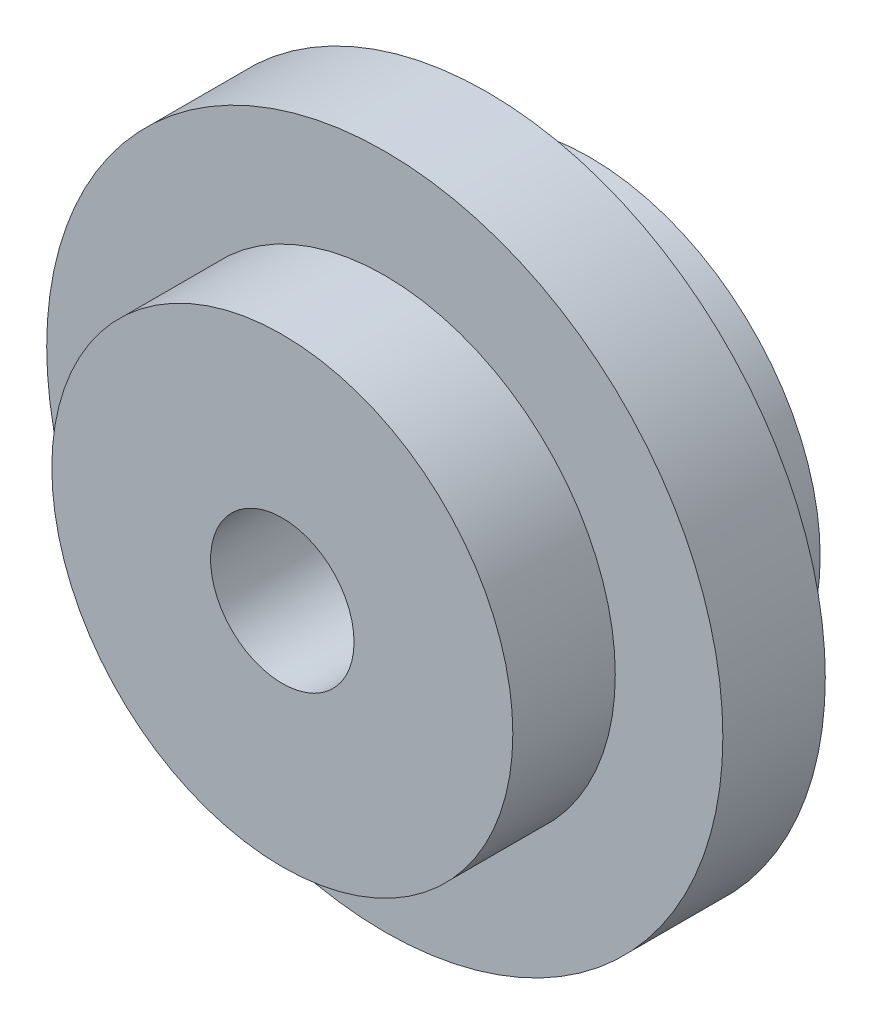
ISO-10303-21;
HEADER;
FILE_DESCRIPTION(('STEP AP214'),'2;1');
FILE_NAME('part.step','',(''),(''),'','','');
FILE_SCHEMA(('AUTOMOTIVE_DESIGN { 1 0 10303 214 1 1 1 1 }'));
ENDSEC;
DATA;
#1=APPLICATION_CONTEXT('core data for automotive mechanical design processes');
#2=APPLICATION_PROTOCOL_DEFINITION('international standard','automotive_design',2000,#1);
#3=PRODUCT_CONTEXT('',#1,'mechanical');
#4=PRODUCT('Part','Part','',(#3));
#5=PRODUCT_RELATED_PRODUCT_CATEGORY('part','',(#4));
#6=PRODUCT_DEFINITION_FORMATION('','',#4);
#7=PRODUCT_DEFINITION_CONTEXT('part definition',#1,'design');
#8=PRODUCT_DEFINITION('design','',#6,#7);
#9=PRODUCT_DEFINITION_SHAPE('','',#8);
#10=(LENGTH_UNIT() NAMED_UNIT(*) SI_UNIT(.MILLI.,.METRE.));
#11=(NAMED_UNIT(*) PLANE_ANGLE_UNIT() SI_UNIT($,.RADIAN.));
#12=(NAMED_UNIT(*) SI_UNIT($,.STERADIAN.) SOLID_ANGLE_UNIT());
#13=UNCERTAINTY_MEASURE_WITH_UNIT(LENGTH_MEASURE(1.E-05),#10,'distance_accuracy_value','');
#14=(GEOMETRIC_REPRESENTATION_CONTEXT(3) GLOBAL_UNCERTAINTY_ASSIGNED_CONTEXT((#13)) GLOBAL_UNIT_ASSIGNED_CONTEXT((#10,
#11,#12)) REPRESENTATION_CONTEXT('',''));
#15=CARTESIAN_POINT('',(0.,0.,0.));
#16=DIRECTION('',(0.,0.,1.));
#17=DIRECTION('',(1.,0.,0.));
#18=AXIS2_PLACEMENT_3D('',#15,#16,#17);
#19=CARTESIAN_POINT('',(0.,0.,31.));
#20=DIRECTION('',(0.,0.,1.));
#21=DIRECTION('',(1.,0.,0.));
#22=AXIS2_PLACEMENT_3D('',#19,#20,#21);
#23=CYLINDRICAL_SURFACE('',#22,6.6);
#24=CARTESIAN_POINT('',(0.,0.,31.));
#25=DIRECTION('',(0.,0.,1.));
#26=DIRECTION('',(1.,0.,0.));
#27=AXIS2_PLACEMENT_3D('',#24,#25,#26);
#28=CIRCLE('',#27,6.6);
#29=CARTESIAN_POINT('',(6.6,0.,31.));
#30=VERTEX_POINT('',#29);
#31=EDGE_CURVE('E44',#30,#30,#28,.T.);
#32=ORIENTED_EDGE('',*,*,#31,.T.);
#33=EDGE_LOOP('',(#32));
#34=FACE_BOUND('',#33,.T.);
#35=CARTESIAN_POINT('',(0.,0.,33.));
#36=DIRECTION('',(0.,0.,1.));
#37=DIRECTION('',(1.,0.,0.));
#38=AXIS2_PLACEMENT_3D('',#35,#36,#37);
#39=CIRCLE('',#38,6.6);
#40=CARTESIAN_POINT('',(6.6,0.,33.));
#41=VERTEX_POINT('',#40);
#42=EDGE_CURVE('E47',#41,#41,#39,.T.);
#43=ORIENTED_EDGE('',*,*,#42,.F.);
#44=EDGE_LOOP('',(#43));
#45=FACE_BOUND('',#44,.T.);
#46=ADVANCED_FACE('F39',(#34,#45),#23,.T.);
#47=CARTESIAN_POINT('',(0.,0.,31.));
#48=DIRECTION('',(0.,0.,1.));
#49=DIRECTION('',(1.,0.,0.));
#50=AXIS2_PLACEMENT_3D('',#47,#48,#49);
#51=PLANE('',#50);
#52=CARTESIAN_POINT('',(0.,0.,31.));
#53=DIRECTION('',(0.,0.,1.));
#54=DIRECTION('',(1.,0.,0.));
#55=AXIS2_PLACEMENT_3D('',#52,#53,#54);
#56=CIRCLE('',#55,4.5);
#57=CARTESIAN_POINT('',(4.5,0.,31.));
#58=VERTEX_POINT('',#57);
#59=EDGE_CURVE('E53',#58,#58,#56,.T.);
#60=ORIENTED_EDGE('',*,*,#59,.T.);
#61=EDGE_LOOP('',(#60));
#62=FACE_BOUND('',#61,.T.);
#63=ORIENTED_EDGE('',*,*,#31,.F.);
#64=EDGE_LOOP('',(#63));
#65=FACE_BOUND('',#64,.T.);
#66=ADVANCED_FACE('F95',(#62,#65),#51,.F.);
#67=CARTESIAN_POINT('',(0.,0.,33.));
#68=DIRECTION('',(0.,0.,1.));
#69=DIRECTION('',(1.,0.,0.));
#70=AXIS2_PLACEMENT_3D('',#67,#68,#69);
#71=PLANE('',#70);
#72=CARTESIAN_POINT('',(0.,0.,33.));
#73=DIRECTION('',(0.,0.,1.));
#74=DIRECTION('',(1.,0.,0.));
#75=AXIS2_PLACEMENT_3D('',#72,#73,#74);
#76=CIRCLE('',#75,4.5);
#77=CARTESIAN_POINT('',(4.5,0.,33.));
#78=VERTEX_POINT('',#77);
#79=EDGE_CURVE('E11',#78,#78,#76,.T.);
#80=ORIENTED_EDGE('',*,*,#79,.F.);
#81=EDGE_LOOP('',(#80));
#82=FACE_BOUND('',#81,.T.);
#83=ORIENTED_EDGE('',*,*,#42,.T.);
#84=EDGE_LOOP('',(#83));
#85=FACE_BOUND('',#84,.T.);
#86=ADVANCED_FACE('F76',(#82,#85),#71,.T.);
#87=CARTESIAN_POINT('',(0.,0.,35.));
#88=DIRECTION('',(0.,0.,1.));
#89=DIRECTION('',(1.,0.,0.));
#90=AXIS2_PLACEMENT_3D('',#87,#88,#89);
#91=PLANE('',#90);
#92=CARTESIAN_POINT('',(0.,0.,35.));
#93=DIRECTION('',(0.,0.,1.));
#94=DIRECTION('',(1.,0.,0.));
#95=AXIS2_PLACEMENT_3D('',#92,#93,#94);
#96=CIRCLE('',#95,1.4);
#97=CARTESIAN_POINT('',(1.4,0.,35.));
#98=VERTEX_POINT('',#97);
#99=EDGE_CURVE('E70',#98,#98,#96,.T.);
#100=ORIENTED_EDGE('',*,*,#99,.F.);
#101=EDGE_LOOP('',(#100));
#102=FACE_BOUND('',#101,.T.);
#103=CARTESIAN_POINT('',(0.,0.,35.));
#104=DIRECTION('',(0.,0.,1.));
#105=DIRECTION('',(1.,0.,0.));
#106=AXIS2_PLACEMENT_3D('',#103,#104,#105);
#107=CIRCLE('',#106,4.5);
#108=CARTESIAN_POINT('',(4.5,0.,35.));
#109=VERTEX_POINT('',#108);
#110=EDGE_CURVE('E62',#109,#109,#107,.T.);
#111=ORIENTED_EDGE('',*,*,#110,.T.);
#112=EDGE_LOOP('',(#111));
#113=FACE_BOUND('',#112,.T.);
#114=ADVANCED_FACE('F75',(#102,#113),#91,.T.);
#115=CARTESIAN_POINT('',(0.,0.,29.));
#116=DIRECTION('',(0.,0.,1.));
#117=DIRECTION('',(1.,0.,0.));
#118=AXIS2_PLACEMENT_3D('',#115,#116,#117);
#119=CYLINDRICAL_SURFACE('',#118,4.5);
#120=ORIENTED_EDGE('',*,*,#79,.T.);
#121=EDGE_LOOP('',(#120));
#122=FACE_BOUND('',#121,.T.);
#123=ORIENTED_EDGE('',*,*,#110,.F.);
#124=EDGE_LOOP('',(#123));
#125=FACE_BOUND('',#124,.T.);
#126=ADVANCED_FACE('F80',(#122,#125),#119,.T.);
#127=CARTESIAN_POINT('',(0.,0.,29.));
#128=DIRECTION('',(0.,0.,1.));
#129=DIRECTION('',(1.,0.,0.));
#130=AXIS2_PLACEMENT_3D('',#127,#128,#129);
#131=CIRCLE('',#130,4.5);
#132=CARTESIAN_POINT('',(4.5,0.,29.));
#133=VERTEX_POINT('',#132);
#134=EDGE_CURVE('E59',#133,#133,#131,.T.);
#135=ORIENTED_EDGE('',*,*,#134,.T.);
#136=EDGE_LOOP('',(#135));
#137=FACE_BOUND('',#136,.T.);
#138=ORIENTED_EDGE('',*,*,#59,.F.);
#139=EDGE_LOOP('',(#138));
#140=FACE_BOUND('',#139,.T.);
#141=ADVANCED_FACE('F84',(#137,#140),#119,.T.);
#142=CARTESIAN_POINT('',(0.,0.,29.));
#143=DIRECTION('',(0.,0.,1.));
#144=DIRECTION('',(1.,0.,0.));
#145=AXIS2_PLACEMENT_3D('',#142,#143,#144);
#146=PLANE('',#145);
#147=CARTESIAN_POINT('',(0.,0.,29.));
#148=DIRECTION('',(0.,0.,1.));
#149=DIRECTION('',(1.,0.,0.));
#150=AXIS2_PLACEMENT_3D('',#147,#148,#149);
#151=CIRCLE('',#150,1.46);
#152=CARTESIAN_POINT('',(1.46,0.,29.));
#153=VERTEX_POINT('',#152);
#154=EDGE_CURVE('E61',#153,#153,#151,.T.);
#155=ORIENTED_EDGE('',*,*,#154,.T.);
#156=EDGE_LOOP('',(#155));
#157=FACE_BOUND('',#156,.T.);
#158=ORIENTED_EDGE('',*,*,#134,.F.);
#159=EDGE_LOOP('',(#158));
#160=FACE_BOUND('',#159,.T.);
#161=ADVANCED_FACE('F87',(#157,#160),#146,.F.);
#162=CARTESIAN_POINT('',(0.,0.,35.));
#163=DIRECTION('',(0.,0.,-1.));
#164=DIRECTION('',(-1.,0.,0.));
#165=AXIS2_PLACEMENT_3D('',#162,#163,#164);
#166=CONICAL_SURFACE('',#165,1.4,0.00999966668666523);
#167=ORIENTED_EDGE('',*,*,#99,.T.);
#168=EDGE_LOOP('',(#167));
#169=FACE_BOUND('',#168,.T.);
#170=ORIENTED_EDGE('',*,*,#154,.F.);
#171=EDGE_LOOP('',(#170));
#172=FACE_BOUND('',#171,.T.);
#173=ADVANCED_FACE('F73',(#169,#172),#166,.F.);
#174=CLOSED_SHELL('',(#46,#66,#86,#114,#126,#141,#161,#173));
#175=MANIFOLD_SOLID_BREP('B2',#174);
#176=ADVANCED_BREP_SHAPE_REPRESENTATION('',(#18,#175),#14);
#177=SHAPE_DEFINITION_REPRESENTATION(#9,#176);
ENDSEC;
END-ISO-10303-21;
